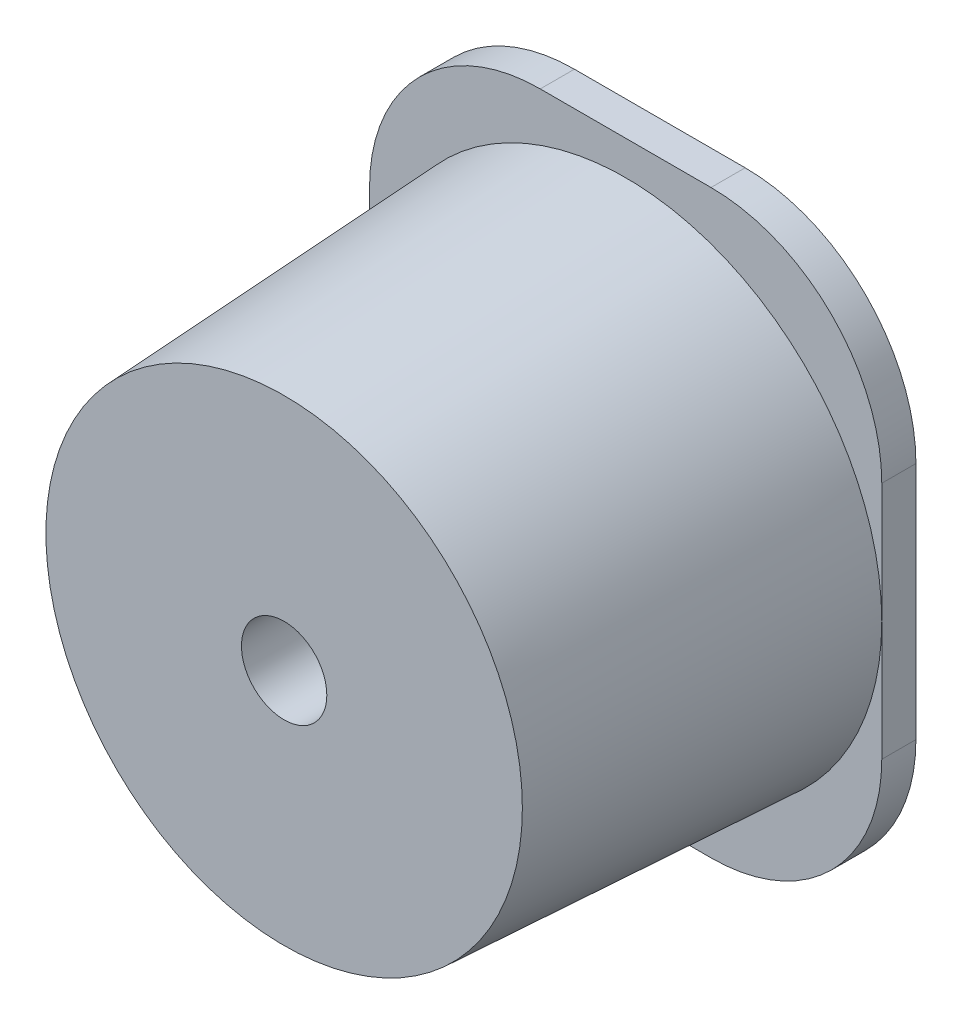
ISO-10303-21;
HEADER;
FILE_DESCRIPTION(('STEP AP214'),'2;1');
FILE_NAME('part.step','',(''),(''),'','','');
FILE_SCHEMA(('AUTOMOTIVE_DESIGN { 1 0 10303 214 1 1 1 1 }'));
ENDSEC;
DATA;
#1=APPLICATION_CONTEXT('core data for automotive mechanical design processes');
#2=APPLICATION_PROTOCOL_DEFINITION('international standard','automotive_design',2000,#1);
#3=PRODUCT_CONTEXT('',#1,'mechanical');
#4=PRODUCT('Part','Part','',(#3));
#5=PRODUCT_RELATED_PRODUCT_CATEGORY('part','',(#4));
#6=PRODUCT_DEFINITION_FORMATION('','',#4);
#7=PRODUCT_DEFINITION_CONTEXT('part definition',#1,'design');
#8=PRODUCT_DEFINITION('design','',#6,#7);
#9=PRODUCT_DEFINITION_SHAPE('','',#8);
#10=(LENGTH_UNIT() NAMED_UNIT(*) SI_UNIT(.MILLI.,.METRE.));
#11=(NAMED_UNIT(*) PLANE_ANGLE_UNIT() SI_UNIT($,.RADIAN.));
#12=(NAMED_UNIT(*) SI_UNIT($,.STERADIAN.) SOLID_ANGLE_UNIT());
#13=UNCERTAINTY_MEASURE_WITH_UNIT(LENGTH_MEASURE(1.E-05),#10,'distance_accuracy_value','');
#14=(GEOMETRIC_REPRESENTATION_CONTEXT(3) GLOBAL_UNCERTAINTY_ASSIGNED_CONTEXT((#13)) GLOBAL_UNIT_ASSIGNED_CONTEXT((#10,
#11,#12)) REPRESENTATION_CONTEXT('',''));
#15=CARTESIAN_POINT('',(0.,0.,0.));
#16=DIRECTION('',(0.,0.,1.));
#17=DIRECTION('',(1.,0.,0.));
#18=AXIS2_PLACEMENT_3D('',#15,#16,#17);
#19=CARTESIAN_POINT('',(0.,0.,0.));
#20=DIRECTION('',(0.,0.,-1.));
#21=DIRECTION('',(1.,0.,0.));
#22=AXIS2_PLACEMENT_3D('',#19,#20,#21);
#23=CONICAL_SURFACE('',#22,75.,0.05235987755983);
#24=CARTESIAN_POINT('',(0.,0.,100.));
#25=DIRECTION('',(0.,0.,1.));
#26=DIRECTION('',(1.,0.,0.));
#27=AXIS2_PLACEMENT_3D('',#24,#25,#26);
#28=CIRCLE('',#27,69.7592220716959);
#29=CARTESIAN_POINT('',(69.7592220716959,0.,100.));
#30=VERTEX_POINT('',#29);
#31=EDGE_CURVE('E11',#30,#30,#28,.T.);
#32=ORIENTED_EDGE('',*,*,#31,.F.);
#33=EDGE_LOOP('',(#32));
#34=FACE_BOUND('',#33,.T.);
#35=CARTESIAN_POINT('',(0.,0.,0.));
#36=DIRECTION('',(0.,0.,1.));
#37=DIRECTION('',(1.,0.,0.));
#38=AXIS2_PLACEMENT_3D('',#35,#36,#37);
#39=CIRCLE('',#38,75.);
#40=CARTESIAN_POINT('',(75.,0.,0.));
#41=VERTEX_POINT('',#40);
#42=CARTESIAN_POINT('',(-75.,0.,0.));
#43=VERTEX_POINT('',#42);
#44=EDGE_CURVE('E41',#41,#43,#39,.T.);
#45=ORIENTED_EDGE('',*,*,#44,.T.);
#46=EDGE_CURVE('E55',#43,#41,#39,.T.);
#47=ORIENTED_EDGE('',*,*,#46,.T.);
#48=EDGE_LOOP('',(#45,#47));
#49=FACE_BOUND('',#48,.T.);
#50=ADVANCED_FACE('F34',(#34,#49),#23,.T.);
#51=CARTESIAN_POINT('',(0.,0.,100.));
#52=DIRECTION('',(0.,0.,1.));
#53=DIRECTION('',(1.,0.,0.));
#54=AXIS2_PLACEMENT_3D('',#51,#52,#53);
#55=PLANE('',#54);
#56=CARTESIAN_POINT('',(0.,0.,100.));
#57=DIRECTION('',(0.,0.,1.));
#58=DIRECTION('',(1.,0.,0.));
#59=AXIS2_PLACEMENT_3D('',#56,#57,#58);
#60=CIRCLE('',#59,12.5);
#61=CARTESIAN_POINT('',(12.5,0.,100.));
#62=VERTEX_POINT('',#61);
#63=EDGE_CURVE('E302',#62,#62,#60,.T.);
#64=ORIENTED_EDGE('',*,*,#63,.F.);
#65=EDGE_LOOP('',(#64));
#66=FACE_BOUND('',#65,.T.);
#67=ORIENTED_EDGE('',*,*,#31,.T.);
#68=EDGE_LOOP('',(#67));
#69=FACE_BOUND('',#68,.T.);
#70=ADVANCED_FACE('F215',(#66,#69),#55,.T.);
#71=CARTESIAN_POINT('',(25.,-35.,0.));
#72=DIRECTION('',(0.,0.,1.));
#73=DIRECTION('',(1.,0.,0.));
#74=AXIS2_PLACEMENT_3D('',#71,#72,#73);
#75=PLANE('',#74);
#76=ORIENTED_EDGE('',*,*,#44,.F.);
#77=DIRECTION('',(0.,-1.,0.));
#78=VECTOR('',#77,1.);
#79=CARTESIAN_POINT('',(75.,-34.9999999999997,0.));
#80=LINE('',#79,#78);
#81=CARTESIAN_POINT('',(75.,34.9999999999996,0.));
#82=VERTEX_POINT('',#81);
#83=EDGE_CURVE('E48',#82,#41,#80,.T.);
#84=ORIENTED_EDGE('',*,*,#83,.F.);
#85=CARTESIAN_POINT('',(25.,35.,0.));
#86=DIRECTION('',(0.,0.,-1.));
#87=DIRECTION('',(1.,0.,0.));
#88=AXIS2_PLACEMENT_3D('',#85,#86,#87);
#89=CIRCLE('',#88,50.);
#90=CARTESIAN_POINT('',(24.9999999999997,85.,0.));
#91=VERTEX_POINT('',#90);
#92=EDGE_CURVE('E162',#91,#82,#89,.T.);
#93=ORIENTED_EDGE('',*,*,#92,.F.);
#94=DIRECTION('',(1.,0.,0.));
#95=VECTOR('',#94,1.);
#96=CARTESIAN_POINT('',(24.9999999999997,85.,0.));
#97=LINE('',#96,#95);
#98=CARTESIAN_POINT('',(-24.9999999999996,85.,0.));
#99=VERTEX_POINT('',#98);
#100=EDGE_CURVE('E156',#99,#91,#97,.T.);
#101=ORIENTED_EDGE('',*,*,#100,.F.);
#102=CARTESIAN_POINT('',(-25.,35.,0.));
#103=DIRECTION('',(0.,0.,-1.));
#104=DIRECTION('',(1.,0.,0.));
#105=AXIS2_PLACEMENT_3D('',#102,#103,#104);
#106=CIRCLE('',#105,50.);
#107=CARTESIAN_POINT('',(-75.,34.9999999999996,0.));
#108=VERTEX_POINT('',#107);
#109=EDGE_CURVE('E144',#108,#99,#106,.T.);
#110=ORIENTED_EDGE('',*,*,#109,.F.);
#111=DIRECTION('',(0.,1.,0.));
#112=VECTOR('',#111,1.);
#113=CARTESIAN_POINT('',(-75.,-34.9999999999997,0.));
#114=LINE('',#113,#112);
#115=EDGE_CURVE('E141',#43,#108,#114,.T.);
#116=ORIENTED_EDGE('',*,*,#115,.F.);
#117=EDGE_LOOP('',(#76,#84,#93,#101,#110,#116));
#118=FACE_BOUND('',#117,.T.);
#119=ADVANCED_FACE('F138',(#118),#75,.T.);
#120=ORIENTED_EDGE('',*,*,#46,.F.);
#121=CARTESIAN_POINT('',(-75.,-35.,0.));
#122=VERTEX_POINT('',#121);
#123=EDGE_CURVE('E148',#122,#43,#114,.T.);
#124=ORIENTED_EDGE('',*,*,#123,.F.);
#125=CARTESIAN_POINT('',(-25.,-35.,0.));
#126=DIRECTION('',(0.,0.,-1.));
#127=DIRECTION('',(-1.,0.,0.));
#128=AXIS2_PLACEMENT_3D('',#125,#126,#127);
#129=CIRCLE('',#128,50.);
#130=CARTESIAN_POINT('',(-24.9999999999996,-85.,0.));
#131=VERTEX_POINT('',#130);
#132=EDGE_CURVE('E149',#131,#122,#129,.T.);
#133=ORIENTED_EDGE('',*,*,#132,.F.);
#134=DIRECTION('',(-1.,0.,0.));
#135=VECTOR('',#134,1.);
#136=CARTESIAN_POINT('',(24.9999999999997,-85.,0.));
#137=LINE('',#136,#135);
#138=CARTESIAN_POINT('',(24.9999999999997,-85.,0.));
#139=VERTEX_POINT('',#138);
#140=EDGE_CURVE('E192',#139,#131,#137,.T.);
#141=ORIENTED_EDGE('',*,*,#140,.F.);
#142=CARTESIAN_POINT('',(25.,-35.,0.));
#143=DIRECTION('',(0.,0.,-1.));
#144=DIRECTION('',(1.,0.,0.));
#145=AXIS2_PLACEMENT_3D('',#142,#143,#144);
#146=CIRCLE('',#145,50.);
#147=CARTESIAN_POINT('',(75.,-34.9999999999997,0.));
#148=VERTEX_POINT('',#147);
#149=EDGE_CURVE('E129',#148,#139,#146,.T.);
#150=ORIENTED_EDGE('',*,*,#149,.F.);
#151=EDGE_CURVE('E164',#41,#148,#80,.T.);
#152=ORIENTED_EDGE('',*,*,#151,.F.);
#153=EDGE_LOOP('',(#120,#124,#133,#141,#150,#152));
#154=FACE_BOUND('',#153,.T.);
#155=ADVANCED_FACE('F196',(#154),#75,.T.);
#156=CARTESIAN_POINT('',(25.,-35.,-10.));
#157=DIRECTION('',(0.,0.,1.));
#158=DIRECTION('',(1.,0.,0.));
#159=AXIS2_PLACEMENT_3D('',#156,#157,#158);
#160=CYLINDRICAL_SURFACE('',#159,50.);
#161=ORIENTED_EDGE('',*,*,#149,.T.);
#162=DIRECTION('',(0.,0.,1.));
#163=VECTOR('',#162,1.);
#164=CARTESIAN_POINT('',(24.9999999999997,-85.,-10.));
#165=LINE('',#164,#163);
#166=CARTESIAN_POINT('',(24.9999999999997,-85.,-10.));
#167=VERTEX_POINT('',#166);
#168=EDGE_CURVE('E110',#167,#139,#165,.T.);
#169=ORIENTED_EDGE('',*,*,#168,.F.);
#170=CARTESIAN_POINT('',(25.,-35.,-10.));
#171=DIRECTION('',(0.,0.,-1.));
#172=DIRECTION('',(1.,0.,0.));
#173=AXIS2_PLACEMENT_3D('',#170,#171,#172);
#174=CIRCLE('',#173,50.);
#175=CARTESIAN_POINT('',(75.,-34.9999999999997,-10.));
#176=VERTEX_POINT('',#175);
#177=EDGE_CURVE('E117',#176,#167,#174,.T.);
#178=ORIENTED_EDGE('',*,*,#177,.F.);
#179=DIRECTION('',(0.,0.,1.));
#180=VECTOR('',#179,1.);
#181=CARTESIAN_POINT('',(75.,-34.9999999999997,-10.));
#182=LINE('',#181,#180);
#183=EDGE_CURVE('E166',#176,#148,#182,.T.);
#184=ORIENTED_EDGE('',*,*,#183,.T.);
#185=EDGE_LOOP('',(#161,#169,#178,#184));
#186=FACE_BOUND('',#185,.T.);
#187=ADVANCED_FACE('F127',(#186),#160,.T.);
#188=CARTESIAN_POINT('',(24.9999999999997,-85.,-10.));
#189=DIRECTION('',(0.,1.,0.));
#190=DIRECTION('',(0.,0.,1.));
#191=AXIS2_PLACEMENT_3D('',#188,#189,#190);
#192=PLANE('',#191);
#193=ORIENTED_EDGE('',*,*,#140,.T.);
#194=DIRECTION('',(0.,0.,1.));
#195=VECTOR('',#194,1.);
#196=CARTESIAN_POINT('',(-24.9999999999996,-85.,-10.));
#197=LINE('',#196,#195);
#198=CARTESIAN_POINT('',(-24.9999999999996,-85.,-10.));
#199=VERTEX_POINT('',#198);
#200=EDGE_CURVE('E113',#199,#131,#197,.T.);
#201=ORIENTED_EDGE('',*,*,#200,.F.);
#202=DIRECTION('',(-1.,0.,0.));
#203=VECTOR('',#202,1.);
#204=CARTESIAN_POINT('',(24.9999999999997,-85.,-10.));
#205=LINE('',#204,#203);
#206=EDGE_CURVE('E106',#167,#199,#205,.T.);
#207=ORIENTED_EDGE('',*,*,#206,.F.);
#208=ORIENTED_EDGE('',*,*,#168,.T.);
#209=EDGE_LOOP('',(#193,#201,#207,#208));
#210=FACE_BOUND('',#209,.T.);
#211=ADVANCED_FACE('F108',(#210),#192,.F.);
#212=CARTESIAN_POINT('',(-25.,-35.,-10.));
#213=DIRECTION('',(0.,0.,1.));
#214=DIRECTION('',(1.,0.,0.));
#215=AXIS2_PLACEMENT_3D('',#212,#213,#214);
#216=CYLINDRICAL_SURFACE('',#215,50.);
#217=ORIENTED_EDGE('',*,*,#132,.T.);
#218=DIRECTION('',(0.,0.,1.));
#219=VECTOR('',#218,1.);
#220=CARTESIAN_POINT('',(-75.,-35.,-10.));
#221=LINE('',#220,#219);
#222=CARTESIAN_POINT('',(-75.,-35.,-10.));
#223=VERTEX_POINT('',#222);
#224=EDGE_CURVE('E131',#223,#122,#221,.T.);
#225=ORIENTED_EDGE('',*,*,#224,.F.);
#226=CARTESIAN_POINT('',(-25.,-35.,-10.));
#227=DIRECTION('',(0.,0.,-1.));
#228=DIRECTION('',(-1.,0.,0.));
#229=AXIS2_PLACEMENT_3D('',#226,#227,#228);
#230=CIRCLE('',#229,50.);
#231=EDGE_CURVE('E116',#199,#223,#230,.T.);
#232=ORIENTED_EDGE('',*,*,#231,.F.);
#233=ORIENTED_EDGE('',*,*,#200,.T.);
#234=EDGE_LOOP('',(#217,#225,#232,#233));
#235=FACE_BOUND('',#234,.T.);
#236=ADVANCED_FACE('F195',(#235),#216,.T.);
#237=CARTESIAN_POINT('',(-75.,-34.9999999999997,-10.));
#238=DIRECTION('',(1.,0.,0.));
#239=DIRECTION('',(0.,0.,-1.));
#240=AXIS2_PLACEMENT_3D('',#237,#238,#239);
#241=PLANE('',#240);
#242=ORIENTED_EDGE('',*,*,#123,.T.);
#243=ORIENTED_EDGE('',*,*,#115,.T.);
#244=DIRECTION('',(0.,0.,1.));
#245=VECTOR('',#244,1.);
#246=CARTESIAN_POINT('',(-75.,34.9999999999996,-10.));
#247=LINE('',#246,#245);
#248=CARTESIAN_POINT('',(-75.,34.9999999999996,-10.));
#249=VERTEX_POINT('',#248);
#250=EDGE_CURVE('E176',#249,#108,#247,.T.);
#251=ORIENTED_EDGE('',*,*,#250,.F.);
#252=DIRECTION('',(0.,1.,0.));
#253=VECTOR('',#252,1.);
#254=CARTESIAN_POINT('',(-75.,-34.9999999999997,-10.));
#255=LINE('',#254,#253);
#256=EDGE_CURVE('E182',#223,#249,#255,.T.);
#257=ORIENTED_EDGE('',*,*,#256,.F.);
#258=ORIENTED_EDGE('',*,*,#224,.T.);
#259=EDGE_LOOP('',(#242,#243,#251,#257,#258));
#260=FACE_BOUND('',#259,.T.);
#261=ADVANCED_FACE('F152',(#260),#241,.F.);
#262=CARTESIAN_POINT('',(-25.,35.,-10.));
#263=DIRECTION('',(0.,0.,1.));
#264=DIRECTION('',(1.,0.,0.));
#265=AXIS2_PLACEMENT_3D('',#262,#263,#264);
#266=CYLINDRICAL_SURFACE('',#265,50.);
#267=ORIENTED_EDGE('',*,*,#109,.T.);
#268=DIRECTION('',(0.,0.,1.));
#269=VECTOR('',#268,1.);
#270=CARTESIAN_POINT('',(-24.9999999999996,85.,-10.));
#271=LINE('',#270,#269);
#272=CARTESIAN_POINT('',(-24.9999999999996,85.,-10.));
#273=VERTEX_POINT('',#272);
#274=EDGE_CURVE('E173',#273,#99,#271,.T.);
#275=ORIENTED_EDGE('',*,*,#274,.F.);
#276=CARTESIAN_POINT('',(-25.,35.,-10.));
#277=DIRECTION('',(0.,0.,-1.));
#278=DIRECTION('',(1.,0.,0.));
#279=AXIS2_PLACEMENT_3D('',#276,#277,#278);
#280=CIRCLE('',#279,50.);
#281=EDGE_CURVE('E181',#249,#273,#280,.T.);
#282=ORIENTED_EDGE('',*,*,#281,.F.);
#283=ORIENTED_EDGE('',*,*,#250,.T.);
#284=EDGE_LOOP('',(#267,#275,#282,#283));
#285=FACE_BOUND('',#284,.T.);
#286=ADVANCED_FACE('F179',(#285),#266,.T.);
#287=CARTESIAN_POINT('',(24.9999999999997,85.,-10.));
#288=DIRECTION('',(0.,-1.,0.));
#289=DIRECTION('',(0.,0.,-1.));
#290=AXIS2_PLACEMENT_3D('',#287,#288,#289);
#291=PLANE('',#290);
#292=ORIENTED_EDGE('',*,*,#100,.T.);
#293=DIRECTION('',(0.,0.,1.));
#294=VECTOR('',#293,1.);
#295=CARTESIAN_POINT('',(24.9999999999997,85.,-10.));
#296=LINE('',#295,#294);
#297=CARTESIAN_POINT('',(24.9999999999997,85.,-10.));
#298=VERTEX_POINT('',#297);
#299=EDGE_CURVE('E170',#298,#91,#296,.T.);
#300=ORIENTED_EDGE('',*,*,#299,.F.);
#301=DIRECTION('',(1.,0.,0.));
#302=VECTOR('',#301,1.);
#303=CARTESIAN_POINT('',(24.9999999999997,85.,-10.));
#304=LINE('',#303,#302);
#305=EDGE_CURVE('E184',#273,#298,#304,.T.);
#306=ORIENTED_EDGE('',*,*,#305,.F.);
#307=ORIENTED_EDGE('',*,*,#274,.T.);
#308=EDGE_LOOP('',(#292,#300,#306,#307));
#309=FACE_BOUND('',#308,.T.);
#310=ADVANCED_FACE('F204',(#309),#291,.F.);
#311=CARTESIAN_POINT('',(25.,35.,-10.));
#312=DIRECTION('',(0.,0.,1.));
#313=DIRECTION('',(1.,0.,0.));
#314=AXIS2_PLACEMENT_3D('',#311,#312,#313);
#315=CYLINDRICAL_SURFACE('',#314,50.);
#316=ORIENTED_EDGE('',*,*,#92,.T.);
#317=DIRECTION('',(0.,0.,1.));
#318=VECTOR('',#317,1.);
#319=CARTESIAN_POINT('',(75.,34.9999999999996,-10.));
#320=LINE('',#319,#318);
#321=CARTESIAN_POINT('',(75.,34.9999999999996,-10.));
#322=VERTEX_POINT('',#321);
#323=EDGE_CURVE('E168',#322,#82,#320,.T.);
#324=ORIENTED_EDGE('',*,*,#323,.F.);
#325=CARTESIAN_POINT('',(25.,35.,-10.));
#326=DIRECTION('',(0.,0.,-1.));
#327=DIRECTION('',(1.,0.,0.));
#328=AXIS2_PLACEMENT_3D('',#325,#326,#327);
#329=CIRCLE('',#328,50.);
#330=EDGE_CURVE('E189',#298,#322,#329,.T.);
#331=ORIENTED_EDGE('',*,*,#330,.F.);
#332=ORIENTED_EDGE('',*,*,#299,.T.);
#333=EDGE_LOOP('',(#316,#324,#331,#332));
#334=FACE_BOUND('',#333,.T.);
#335=ADVANCED_FACE('F201',(#334),#315,.T.);
#336=CARTESIAN_POINT('',(75.,-34.9999999999997,-10.));
#337=DIRECTION('',(-1.,0.,0.));
#338=DIRECTION('',(0.,0.,1.));
#339=AXIS2_PLACEMENT_3D('',#336,#337,#338);
#340=PLANE('',#339);
#341=ORIENTED_EDGE('',*,*,#83,.T.);
#342=ORIENTED_EDGE('',*,*,#151,.T.);
#343=ORIENTED_EDGE('',*,*,#183,.F.);
#344=DIRECTION('',(0.,-1.,0.));
#345=VECTOR('',#344,1.);
#346=CARTESIAN_POINT('',(75.,-34.9999999999997,-10.));
#347=LINE('',#346,#345);
#348=EDGE_CURVE('E122',#322,#176,#347,.T.);
#349=ORIENTED_EDGE('',*,*,#348,.F.);
#350=ORIENTED_EDGE('',*,*,#323,.T.);
#351=EDGE_LOOP('',(#341,#342,#343,#349,#350));
#352=FACE_BOUND('',#351,.T.);
#353=ADVANCED_FACE('F197',(#352),#340,.F.);
#354=CARTESIAN_POINT('',(25.,-35.,-10.));
#355=DIRECTION('',(0.,0.,1.));
#356=DIRECTION('',(1.,0.,0.));
#357=AXIS2_PLACEMENT_3D('',#354,#355,#356);
#358=PLANE('',#357);
#359=ORIENTED_EDGE('',*,*,#177,.T.);
#360=ORIENTED_EDGE('',*,*,#206,.T.);
#361=ORIENTED_EDGE('',*,*,#231,.T.);
#362=ORIENTED_EDGE('',*,*,#256,.T.);
#363=ORIENTED_EDGE('',*,*,#281,.T.);
#364=ORIENTED_EDGE('',*,*,#305,.T.);
#365=ORIENTED_EDGE('',*,*,#330,.T.);
#366=ORIENTED_EDGE('',*,*,#348,.T.);
#367=EDGE_LOOP('',(#359,#360,#361,#362,#363,#364,#365,#366));
#368=FACE_BOUND('',#367,.T.);
#369=ADVANCED_FACE('F120',(#368),#358,.F.);
#370=CARTESIAN_POINT('',(0.,0.,50.));
#371=DIRECTION('',(0.,0.,1.));
#372=DIRECTION('',(1.,0.,0.));
#373=AXIS2_PLACEMENT_3D('',#370,#371,#372);
#374=CYLINDRICAL_SURFACE('',#373,12.5);
#375=CARTESIAN_POINT('',(0.,0.,50.));
#376=DIRECTION('',(0.,0.,1.));
#377=DIRECTION('',(1.,0.,0.));
#378=AXIS2_PLACEMENT_3D('',#375,#376,#377);
#379=CIRCLE('',#378,12.5);
#380=CARTESIAN_POINT('',(12.5,0.,50.));
#381=VERTEX_POINT('',#380);
#382=EDGE_CURVE('E193',#381,#381,#379,.T.);
#383=ORIENTED_EDGE('',*,*,#382,.F.);
#384=EDGE_LOOP('',(#383));
#385=FACE_BOUND('',#384,.T.);
#386=ORIENTED_EDGE('',*,*,#63,.T.);
#387=EDGE_LOOP('',(#386));
#388=FACE_BOUND('',#387,.T.);
#389=ADVANCED_FACE('F270',(#385,#388),#374,.F.);
#390=CARTESIAN_POINT('',(0.,0.,50.));
#391=DIRECTION('',(0.,0.,1.));
#392=DIRECTION('',(1.,0.,0.));
#393=AXIS2_PLACEMENT_3D('',#390,#391,#392);
#394=PLANE('',#393);
#395=ORIENTED_EDGE('',*,*,#382,.T.);
#396=EDGE_LOOP('',(#395));
#397=FACE_BOUND('',#396,.T.);
#398=ADVANCED_FACE('F286',(#397),#394,.T.);
#399=CLOSED_SHELL('',(#50,#70,#119,#155,#187,#211,#236,#261,#286,#310,#335,#353,#369,#389,#398));
#400=MANIFOLD_SOLID_BREP('B2',#399);
#401=ADVANCED_BREP_SHAPE_REPRESENTATION('',(#18,#400),#14);
#402=SHAPE_DEFINITION_REPRESENTATION(#9,#401);
ENDSEC;
END-ISO-10303-21;
